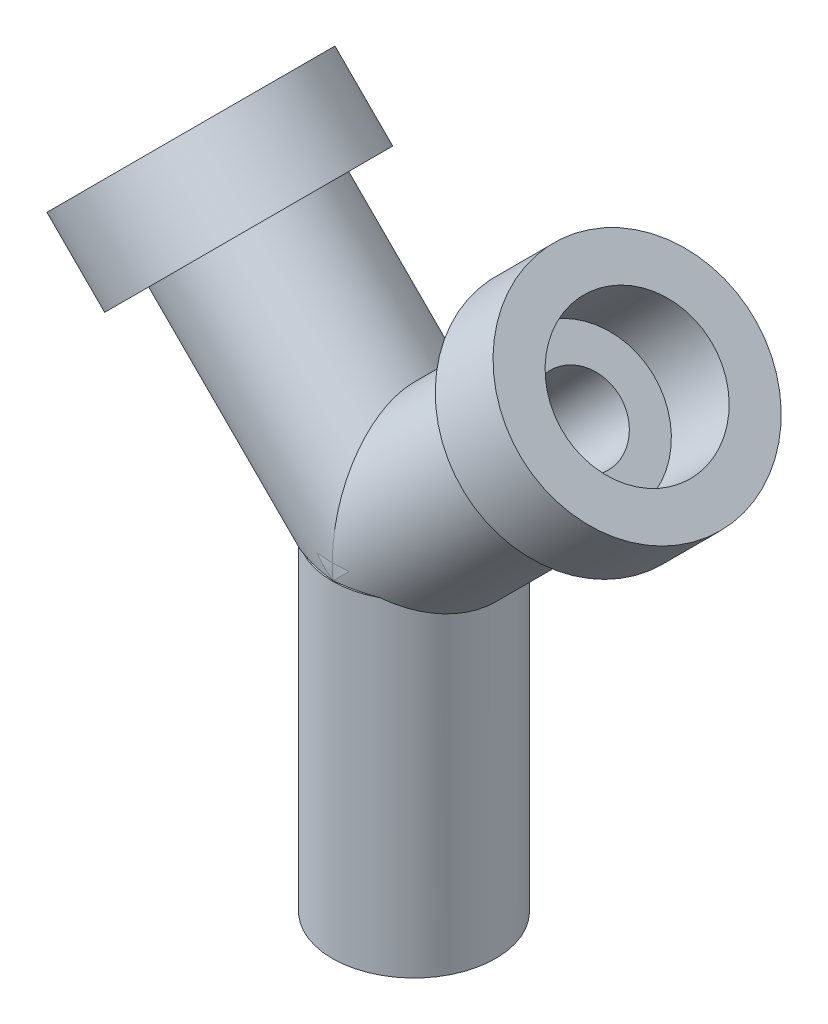
ISO-10303-21;
HEADER;
FILE_DESCRIPTION(('STEP AP214'),'2;1');
FILE_NAME('part.step','',(''),(''),'','','');
FILE_SCHEMA(('AUTOMOTIVE_DESIGN { 1 0 10303 214 1 1 1 1 }'));
ENDSEC;
DATA;
#1=APPLICATION_CONTEXT('core data for automotive mechanical design processes');
#2=APPLICATION_PROTOCOL_DEFINITION('international standard','automotive_design',2000,#1);
#3=PRODUCT_CONTEXT('',#1,'mechanical');
#4=PRODUCT('Part','Part','',(#3));
#5=PRODUCT_RELATED_PRODUCT_CATEGORY('part','',(#4));
#6=PRODUCT_DEFINITION_FORMATION('','',#4);
#7=PRODUCT_DEFINITION_CONTEXT('part definition',#1,'design');
#8=PRODUCT_DEFINITION('design','',#6,#7);
#9=PRODUCT_DEFINITION_SHAPE('','',#8);
#10=(LENGTH_UNIT() NAMED_UNIT(*) SI_UNIT(.MILLI.,.METRE.));
#11=(NAMED_UNIT(*) PLANE_ANGLE_UNIT() SI_UNIT($,.RADIAN.));
#12=(NAMED_UNIT(*) SI_UNIT($,.STERADIAN.) SOLID_ANGLE_UNIT());
#13=UNCERTAINTY_MEASURE_WITH_UNIT(LENGTH_MEASURE(1.E-05),#10,'distance_accuracy_value','');
#14=(GEOMETRIC_REPRESENTATION_CONTEXT(3) GLOBAL_UNCERTAINTY_ASSIGNED_CONTEXT((#13)) GLOBAL_UNIT_ASSIGNED_CONTEXT((#10,
#11,#12)) REPRESENTATION_CONTEXT('',''));
#15=CARTESIAN_POINT('',(0.,0.,0.));
#16=DIRECTION('',(0.,0.,1.));
#17=DIRECTION('',(1.,0.,0.));
#18=AXIS2_PLACEMENT_3D('',#15,#16,#17);
#19=CARTESIAN_POINT('',(-7.00017341424426,-7.67507080195636,0.));
#20=DIRECTION('',(-0.707106781186544,0.707106781186551,0.));
#21=DIRECTION('',(-0.707106781186551,-0.707106781186544,0.));
#22=AXIS2_PLACEMENT_3D('',#19,#20,#21);
#23=CYLINDRICAL_SURFACE('',#22,3.175);
#24=CARTESIAN_POINT('',(-20.4705575958479,5.79531337964745,0.));
#25=DIRECTION('',(-0.707106781186544,0.707106781186551,0.));
#26=DIRECTION('',(-0.707106781186551,-0.707106781186544,0.));
#27=AXIS2_PLACEMENT_3D('',#24,#25,#26);
#28=CIRCLE('',#27,3.175);
#29=CARTESIAN_POINT('',(-22.7156216261152,3.55024934938017,0.));
#30=VERTEX_POINT('',#29);
#31=EDGE_CURVE('E177',#30,#30,#28,.T.);
#32=ORIENTED_EDGE('',*,*,#31,.T.);
#33=EDGE_LOOP('',(#32));
#34=FACE_BOUND('',#33,.T.);
#35=CARTESIAN_POINT('',(-6.38034682848854,-8.29489738771209,0.));
#36=DIRECTION('',(0.,-1.,0.));
#37=DIRECTION('',(-1.,0.,0.));
#38=AXIS2_PLACEMENT_3D('',#35,#36,#37);
#39=ELLIPSE('',#38,4.49012806053455,3.175);
#40=CARTESIAN_POINT('',(-10.6127874993018,-8.29489738771209,1.06011696714215));
#41=VERTEX_POINT('',#40);
#42=CARTESIAN_POINT('',(-7.62,-8.29489738771209,3.05159876248185));
#43=VERTEX_POINT('',#42);
#44=EDGE_CURVE('E127',#41,#43,#39,.F.);
#45=ORIENTED_EDGE('',*,*,#44,.F.);
#46=CARTESIAN_POINT('',(-7.62,-7.05524421620062,0.));
#47=DIRECTION('',(-0.382683432365087,0.923879532511288,0.));
#48=DIRECTION('',(-0.923879532511288,-0.382683432365087,0.));
#49=AXIS2_PLACEMENT_3D('',#46,#47,#48);
#50=ELLIPSE('',#49,3.43659523592835,3.175);
#51=CARTESIAN_POINT('',(-10.6127874993018,-8.29489738771209,-1.06011696714215));
#52=VERTEX_POINT('',#51);
#53=EDGE_CURVE('E137',#41,#52,#50,.F.);
#54=ORIENTED_EDGE('',*,*,#53,.T.);
#55=CARTESIAN_POINT('',(-7.62,-8.29489738771209,-3.05159876248185));
#56=VERTEX_POINT('',#55);
#57=EDGE_CURVE('E130',#56,#52,#39,.F.);
#58=ORIENTED_EDGE('',*,*,#57,.F.);
#59=DIRECTION('',(-0.707106781186544,0.707106781186551,0.));
#60=VECTOR('',#59,1.);
#61=CARTESIAN_POINT('',(-7.61999999999999,-8.2948973877121,-3.05159876248185));
#62=LINE('',#61,#60);
#63=CARTESIAN_POINT('',(-8.85965317151146,-7.05524421620063,-3.05159876248186));
#64=VERTEX_POINT('',#63);
#65=EDGE_CURVE('E159',#64,#56,#62,.F.);
#66=ORIENTED_EDGE('',*,*,#65,.F.);
#67=CARTESIAN_POINT('',(-7.62,-7.05524421620062,0.));
#68=DIRECTION('',(0.,1.,0.));
#69=DIRECTION('',(-1.,0.,0.));
#70=AXIS2_PLACEMENT_3D('',#67,#68,#69);
#71=ELLIPSE('',#70,4.49012806053455,3.175);
#72=CARTESIAN_POINT('',(-7.62,-7.05524421620062,-3.175));
#73=VERTEX_POINT('',#72);
#74=EDGE_CURVE('E170',#73,#64,#71,.T.);
#75=ORIENTED_EDGE('',*,*,#74,.F.);
#76=CARTESIAN_POINT('',(-7.62,-7.05524421620062,0.));
#77=DIRECTION('',(-1.,0.,0.));
#78=DIRECTION('',(0.,1.,0.));
#79=AXIS2_PLACEMENT_3D('',#76,#77,#78);
#80=ELLIPSE('',#79,4.4901280605346,3.175);
#81=CARTESIAN_POINT('',(-7.62,-7.05524421620062,3.175));
#82=VERTEX_POINT('',#81);
#83=EDGE_CURVE('E164',#82,#73,#80,.T.);
#84=ORIENTED_EDGE('',*,*,#83,.F.);
#85=CARTESIAN_POINT('',(-8.85965317151146,-7.05524421620063,3.05159876248186));
#86=VERTEX_POINT('',#85);
#87=EDGE_CURVE('E167',#86,#82,#71,.T.);
#88=ORIENTED_EDGE('',*,*,#87,.F.);
#89=DIRECTION('',(-0.707106781186544,0.707106781186551,0.));
#90=VECTOR('',#89,1.);
#91=CARTESIAN_POINT('',(-7.61999999999999,-8.2948973877121,3.05159876248185));
#92=LINE('',#91,#90);
#93=EDGE_CURVE('E154',#43,#86,#92,.T.);
#94=ORIENTED_EDGE('',*,*,#93,.F.);
#95=EDGE_LOOP('',(#45,#54,#58,#66,#75,#84,#88,#94));
#96=FACE_BOUND('',#95,.T.);
#97=ADVANCED_FACE('F33',(#34,#96),#23,.F.);
#98=CARTESIAN_POINT('',(-8.23982658575574,-7.67507080195636,0.));
#99=DIRECTION('',(0.707106781186544,0.707106781186551,0.));
#100=DIRECTION('',(-0.707106781186551,0.707106781186544,0.));
#101=AXIS2_PLACEMENT_3D('',#98,#99,#100);
#102=CYLINDRICAL_SURFACE('',#101,3.175);
#103=CARTESIAN_POINT('',(5.23055759584792,5.79531337964745,0.));
#104=DIRECTION('',(-0.707106781186544,-0.707106781186551,0.));
#105=DIRECTION('',(0.707106781186551,-0.707106781186544,0.));
#106=AXIS2_PLACEMENT_3D('',#103,#104,#105);
#107=CIRCLE('',#106,3.175);
#108=CARTESIAN_POINT('',(7.47562162611522,3.55024934938017,0.));
#109=VERTEX_POINT('',#108);
#110=EDGE_CURVE('E150',#109,#109,#107,.T.);
#111=ORIENTED_EDGE('',*,*,#110,.F.);
#112=EDGE_LOOP('',(#111));
#113=FACE_BOUND('',#112,.T.);
#114=CARTESIAN_POINT('',(-7.62,-7.05524421620062,0.));
#115=DIRECTION('',(0.382683432365087,0.923879532511288,0.));
#116=DIRECTION('',(0.923879532511288,-0.382683432365087,0.));
#117=AXIS2_PLACEMENT_3D('',#114,#115,#116);
#118=ELLIPSE('',#117,3.43659523592835,3.175);
#119=CARTESIAN_POINT('',(-4.62721250069816,-8.29489738771209,1.06011696714215));
#120=VERTEX_POINT('',#119);
#121=CARTESIAN_POINT('',(-4.62721250069816,-8.29489738771209,-1.06011696714215));
#122=VERTEX_POINT('',#121);
#123=EDGE_CURVE('E11',#120,#122,#118,.T.);
#124=ORIENTED_EDGE('',*,*,#123,.F.);
#125=CARTESIAN_POINT('',(-8.85965317151146,-8.29489738771209,0.));
#126=DIRECTION('',(0.,-1.,0.));
#127=DIRECTION('',(1.,0.,0.));
#128=AXIS2_PLACEMENT_3D('',#125,#126,#127);
#129=ELLIPSE('',#128,4.49012806053455,3.175);
#130=EDGE_CURVE('E122',#120,#43,#129,.T.);
#131=ORIENTED_EDGE('',*,*,#130,.T.);
#132=DIRECTION('',(0.707106781186544,0.707106781186551,0.));
#133=VECTOR('',#132,1.);
#134=CARTESIAN_POINT('',(-7.62000000000001,-8.2948973877121,3.05159876248185));
#135=LINE('',#134,#133);
#136=CARTESIAN_POINT('',(-6.38034682848854,-7.05524421620063,3.05159876248186));
#137=VERTEX_POINT('',#136);
#138=EDGE_CURVE('E41',#137,#43,#135,.F.);
#139=ORIENTED_EDGE('',*,*,#138,.F.);
#140=CARTESIAN_POINT('',(-7.62,-7.05524421620062,0.));
#141=DIRECTION('',(0.,1.,0.));
#142=DIRECTION('',(-1.,0.,0.));
#143=AXIS2_PLACEMENT_3D('',#140,#141,#142);
#144=ELLIPSE('',#143,4.49012806053455,3.175);
#145=EDGE_CURVE('E55',#137,#82,#144,.F.);
#146=ORIENTED_EDGE('',*,*,#145,.T.);
#147=ORIENTED_EDGE('',*,*,#83,.T.);
#148=CARTESIAN_POINT('',(-6.38034682848854,-7.05524421620063,-3.05159876248186));
#149=VERTEX_POINT('',#148);
#150=EDGE_CURVE('E169',#73,#149,#144,.F.);
#151=ORIENTED_EDGE('',*,*,#150,.T.);
#152=DIRECTION('',(0.707106781186544,0.707106781186551,0.));
#153=VECTOR('',#152,1.);
#154=CARTESIAN_POINT('',(-7.62000000000001,-8.2948973877121,-3.05159876248185));
#155=LINE('',#154,#153);
#156=EDGE_CURVE('E142',#56,#149,#155,.T.);
#157=ORIENTED_EDGE('',*,*,#156,.F.);
#158=EDGE_CURVE('E132',#56,#122,#129,.T.);
#159=ORIENTED_EDGE('',*,*,#158,.T.);
#160=EDGE_LOOP('',(#124,#131,#139,#146,#147,#151,#157,#159));
#161=FACE_BOUND('',#160,.T.);
#162=ADVANCED_FACE('F139',(#113,#161),#102,.F.);
#163=CARTESIAN_POINT('',(-8.23982658575573,-7.67507080195636,0.));
#164=DIRECTION('',(-0.707106781186544,-0.707106781186552,0.));
#165=DIRECTION('',(0.707106781186552,-0.707106781186544,0.));
#166=AXIS2_PLACEMENT_3D('',#163,#164,#165);
#167=CYLINDRICAL_SURFACE('',#166,6.35);
#168=CARTESIAN_POINT('',(5.23055759584752,5.79531337964704,0.));
#169=DIRECTION('',(-0.707106781186544,-0.707106781186552,0.));
#170=DIRECTION('',(0.707106781186552,-0.707106781186544,0.));
#171=AXIS2_PLACEMENT_3D('',#168,#169,#170);
#172=CIRCLE('',#171,6.35000000000001);
#173=CARTESIAN_POINT('',(9.72068565638213,1.30518531911249,0.));
#174=VERTEX_POINT('',#173);
#175=EDGE_CURVE('E239',#174,#174,#172,.T.);
#176=ORIENTED_EDGE('',*,*,#175,.T.);
#177=EDGE_LOOP('',(#176));
#178=FACE_BOUND('',#177,.T.);
#179=CARTESIAN_POINT('',(-8.85965317151145,-8.29489738771208,0.));
#180=DIRECTION('',(0.,-1.,0.));
#181=DIRECTION('',(-1.,0.,0.));
#182=AXIS2_PLACEMENT_3D('',#179,#180,#181);
#183=ELLIPSE('',#182,8.98025612106911,6.35);
#184=CARTESIAN_POINT('',(-7.61999999999999,-8.29489738771208,-6.28920742281417));
#185=VERTEX_POINT('',#184);
#186=CARTESIAN_POINT('',(-4.62721250069818,-8.29489738771208,-5.60051095740583));
#187=VERTEX_POINT('',#186);
#188=EDGE_CURVE('E189',#185,#187,#183,.T.);
#189=ORIENTED_EDGE('',*,*,#188,.F.);
#190=DIRECTION('',(-0.707106781186544,-0.707106781186552,0.));
#191=VECTOR('',#190,1.);
#192=CARTESIAN_POINT('',(-7.62,-8.2948973877121,-6.28920742281417));
#193=LINE('',#192,#191);
#194=CARTESIAN_POINT('',(-6.38034682848851,-7.05524421620062,-6.28920742281416));
#195=VERTEX_POINT('',#194);
#196=EDGE_CURVE('E219',#195,#185,#193,.T.);
#197=ORIENTED_EDGE('',*,*,#196,.F.);
#198=CARTESIAN_POINT('',(-7.62,-7.05524421620062,0.));
#199=DIRECTION('',(0.,-1.,0.));
#200=DIRECTION('',(-1.,0.,0.));
#201=AXIS2_PLACEMENT_3D('',#198,#199,#200);
#202=ELLIPSE('',#201,8.98025612106911,6.35);
#203=CARTESIAN_POINT('',(-7.62,-7.05524421620062,-6.35));
#204=VERTEX_POINT('',#203);
#205=EDGE_CURVE('E232',#204,#195,#202,.T.);
#206=ORIENTED_EDGE('',*,*,#205,.F.);
#207=CARTESIAN_POINT('',(-7.62,-7.05524421620062,0.));
#208=DIRECTION('',(-1.,0.,0.));
#209=DIRECTION('',(0.,-1.,0.));
#210=AXIS2_PLACEMENT_3D('',#207,#208,#209);
#211=ELLIPSE('',#210,8.98025612106921,6.35);
#212=CARTESIAN_POINT('',(-7.62,-7.05524421620062,6.35));
#213=VERTEX_POINT('',#212);
#214=EDGE_CURVE('E224',#213,#204,#211,.T.);
#215=ORIENTED_EDGE('',*,*,#214,.F.);
#216=CARTESIAN_POINT('',(-6.38034682848856,-7.05524421620065,6.28920742281417));
#217=VERTEX_POINT('',#216);
#218=EDGE_CURVE('E228',#217,#213,#202,.T.);
#219=ORIENTED_EDGE('',*,*,#218,.F.);
#220=DIRECTION('',(-0.707106781186544,-0.707106781186552,0.));
#221=VECTOR('',#220,1.);
#222=CARTESIAN_POINT('',(-7.62,-8.2948973877121,6.28920742281417));
#223=LINE('',#222,#221);
#224=CARTESIAN_POINT('',(-7.62,-8.29489738771209,6.28920742281417));
#225=VERTEX_POINT('',#224);
#226=EDGE_CURVE('E216',#225,#217,#223,.F.);
#227=ORIENTED_EDGE('',*,*,#226,.F.);
#228=CARTESIAN_POINT('',(-4.62721250069879,-8.29489738771208,5.6005109574061));
#229=VERTEX_POINT('',#228);
#230=EDGE_CURVE('E193',#229,#225,#183,.T.);
#231=ORIENTED_EDGE('',*,*,#230,.F.);
#232=CARTESIAN_POINT('',(-7.62,-7.05524421620062,0.));
#233=DIRECTION('',(-0.382683432365087,-0.923879532511288,0.));
#234=DIRECTION('',(-0.923879532511288,0.382683432365087,0.));
#235=AXIS2_PLACEMENT_3D('',#232,#233,#234);
#236=ELLIPSE('',#235,6.8731904718567,6.35);
#237=EDGE_CURVE('E194',#187,#229,#236,.T.);
#238=ORIENTED_EDGE('',*,*,#237,.F.);
#239=EDGE_LOOP('',(#189,#197,#206,#215,#219,#227,#231,#238));
#240=FACE_BOUND('',#239,.T.);
#241=ADVANCED_FACE('F311',(#178,#240),#167,.T.);
#242=CARTESIAN_POINT('',(-7.00017341424427,-7.67507080195636,0.));
#243=DIRECTION('',(0.707106781186544,-0.707106781186552,0.));
#244=DIRECTION('',(-0.707106781186552,-0.707106781186544,0.));
#245=AXIS2_PLACEMENT_3D('',#242,#243,#244);
#246=CYLINDRICAL_SURFACE('',#245,6.35);
#247=CARTESIAN_POINT('',(-20.4705575958475,5.79531337964704,0.));
#248=DIRECTION('',(-0.707106781186544,0.707106781186552,0.));
#249=DIRECTION('',(-0.707106781186552,-0.707106781186544,0.));
#250=AXIS2_PLACEMENT_3D('',#247,#248,#249);
#251=CIRCLE('',#250,6.35000000000001);
#252=CARTESIAN_POINT('',(-24.9606856563821,1.30518531911249,0.));
#253=VERTEX_POINT('',#252);
#254=EDGE_CURVE('E201',#253,#253,#251,.T.);
#255=ORIENTED_EDGE('',*,*,#254,.F.);
#256=EDGE_LOOP('',(#255));
#257=FACE_BOUND('',#256,.T.);
#258=CARTESIAN_POINT('',(-6.38034682848855,-8.29489738771208,0.));
#259=DIRECTION('',(0.,-1.,0.));
#260=DIRECTION('',(1.,0.,0.));
#261=AXIS2_PLACEMENT_3D('',#258,#259,#260);
#262=ELLIPSE('',#261,8.98025612106911,6.35);
#263=CARTESIAN_POINT('',(-10.6127874993018,-8.29489738771208,5.60051095740583));
#264=VERTEX_POINT('',#263);
#265=EDGE_CURVE('E190',#225,#264,#262,.T.);
#266=ORIENTED_EDGE('',*,*,#265,.F.);
#267=DIRECTION('',(0.707106781186544,-0.707106781186552,0.));
#268=VECTOR('',#267,1.);
#269=CARTESIAN_POINT('',(-7.61999999999999,-8.2948973877121,6.28920742281417));
#270=LINE('',#269,#268);
#271=CARTESIAN_POINT('',(-8.85965317151144,-7.05524421620065,6.28920742281417));
#272=VERTEX_POINT('',#271);
#273=EDGE_CURVE('E258',#225,#272,#270,.F.);
#274=ORIENTED_EDGE('',*,*,#273,.T.);
#275=CARTESIAN_POINT('',(-7.62,-7.05524421620062,0.));
#276=DIRECTION('',(0.,-1.,0.));
#277=DIRECTION('',(-1.,0.,0.));
#278=AXIS2_PLACEMENT_3D('',#275,#276,#277);
#279=ELLIPSE('',#278,8.98025612106911,6.35);
#280=EDGE_CURVE('E235',#272,#213,#279,.F.);
#281=ORIENTED_EDGE('',*,*,#280,.T.);
#282=ORIENTED_EDGE('',*,*,#214,.T.);
#283=CARTESIAN_POINT('',(-8.85965317151144,-7.05524421620065,-6.28920742281417));
#284=VERTEX_POINT('',#283);
#285=EDGE_CURVE('E231',#204,#284,#279,.F.);
#286=ORIENTED_EDGE('',*,*,#285,.T.);
#287=DIRECTION('',(0.707106781186544,-0.707106781186552,0.));
#288=VECTOR('',#287,1.);
#289=CARTESIAN_POINT('',(-7.61999999999999,-8.2948973877121,-6.28920742281417));
#290=LINE('',#289,#288);
#291=EDGE_CURVE('E255',#284,#185,#290,.T.);
#292=ORIENTED_EDGE('',*,*,#291,.T.);
#293=CARTESIAN_POINT('',(-10.6127874993012,-8.29489738771208,-5.6005109574061));
#294=VERTEX_POINT('',#293);
#295=EDGE_CURVE('E186',#294,#185,#262,.T.);
#296=ORIENTED_EDGE('',*,*,#295,.F.);
#297=CARTESIAN_POINT('',(-7.62,-7.05524421620062,0.));
#298=DIRECTION('',(0.382683432365087,-0.923879532511288,0.));
#299=DIRECTION('',(0.923879532511288,0.382683432365087,0.));
#300=AXIS2_PLACEMENT_3D('',#297,#298,#299);
#301=ELLIPSE('',#300,6.8731904718567,6.35);
#302=EDGE_CURVE('E261',#264,#294,#301,.T.);
#303=ORIENTED_EDGE('',*,*,#302,.F.);
#304=EDGE_LOOP('',(#266,#274,#281,#282,#286,#292,#296,#303));
#305=FACE_BOUND('',#304,.T.);
#306=ADVANCED_FACE('F320',(#257,#305),#246,.T.);
#307=CARTESIAN_POINT('',(5.23055759584792,5.79531337964744,0.));
#308=DIRECTION('',(-0.707106781186544,-0.707106781186552,0.));
#309=DIRECTION('',(0.707106781186552,-0.707106781186544,0.));
#310=AXIS2_PLACEMENT_3D('',#307,#308,#309);
#311=PLANE('',#310);
#312=ORIENTED_EDGE('',*,*,#110,.T.);
#313=EDGE_LOOP('',(#312));
#314=FACE_BOUND('',#313,.T.);
#315=CARTESIAN_POINT('',(5.23055759584792,5.79531337964744,0.));
#316=DIRECTION('',(-0.707106781186544,-0.707106781186552,0.));
#317=DIRECTION('',(0.707106781186552,-0.707106781186544,0.));
#318=AXIS2_PLACEMENT_3D('',#315,#316,#317);
#319=CIRCLE('',#318,5.84200000000033);
#320=CARTESIAN_POINT('',(9.36147541153999,1.66439556395542,0.));
#321=VERTEX_POINT('',#320);
#322=EDGE_CURVE('E252',#321,#321,#319,.T.);
#323=ORIENTED_EDGE('',*,*,#322,.F.);
#324=EDGE_LOOP('',(#323));
#325=FACE_BOUND('',#324,.T.);
#326=ADVANCED_FACE('F35',(#314,#325),#311,.F.);
#327=CARTESIAN_POINT('',(-8.23982658575573,-7.67507080195636,0.));
#328=DIRECTION('',(-0.707106781186544,-0.707106781186552,0.));
#329=DIRECTION('',(0.707106781186552,-0.707106781186544,0.));
#330=AXIS2_PLACEMENT_3D('',#327,#328,#329);
#331=CYLINDRICAL_SURFACE('',#330,5.84200000000033);
#332=CARTESIAN_POINT('',(9.72068565638207,10.2854414401816,0.));
#333=DIRECTION('',(-0.707106781186544,-0.707106781186552,0.));
#334=DIRECTION('',(0.707106781186552,-0.707106781186544,0.));
#335=AXIS2_PLACEMENT_3D('',#332,#333,#334);
#336=CIRCLE('',#335,5.84200000000033);
#337=CARTESIAN_POINT('',(13.8516034720741,6.15452362448962,0.));
#338=VERTEX_POINT('',#337);
#339=EDGE_CURVE('E249',#338,#338,#336,.T.);
#340=ORIENTED_EDGE('',*,*,#339,.F.);
#341=EDGE_LOOP('',(#340));
#342=FACE_BOUND('',#341,.T.);
#343=ORIENTED_EDGE('',*,*,#322,.T.);
#344=EDGE_LOOP('',(#343));
#345=FACE_BOUND('',#344,.T.);
#346=ADVANCED_FACE('F441',(#342,#345),#331,.F.);
#347=CARTESIAN_POINT('',(5.58976784069,14.4163592558737,0.));
#348=DIRECTION('',(-0.707106781186544,-0.707106781186552,0.));
#349=DIRECTION('',(0.707106781186552,-0.707106781186544,0.));
#350=AXIS2_PLACEMENT_3D('',#347,#348,#349);
#351=PLANE('',#350);
#352=CARTESIAN_POINT('',(9.72068565638207,10.2854414401816,0.));
#353=DIRECTION('',(-0.707106781186544,-0.707106781186552,0.));
#354=DIRECTION('',(0.707106781186552,-0.707106781186544,0.));
#355=AXIS2_PLACEMENT_3D('',#352,#353,#354);
#356=CIRCLE('',#355,9.14400000000033);
#357=CARTESIAN_POINT('',(16.1864700635521,3.81965703301165,0.));
#358=VERTEX_POINT('',#357);
#359=EDGE_CURVE('E246',#358,#358,#356,.T.);
#360=ORIENTED_EDGE('',*,*,#359,.F.);
#361=EDGE_LOOP('',(#360));
#362=FACE_BOUND('',#361,.T.);
#363=ORIENTED_EDGE('',*,*,#339,.T.);
#364=EDGE_LOOP('',(#363));
#365=FACE_BOUND('',#364,.T.);
#366=ADVANCED_FACE('F602',(#362,#365),#351,.F.);
#367=CARTESIAN_POINT('',(-8.23982658575573,-7.67507080195636,0.));
#368=DIRECTION('',(-0.707106781186544,-0.707106781186552,0.));
#369=DIRECTION('',(0.707106781186552,-0.707106781186544,0.));
#370=AXIS2_PLACEMENT_3D('',#367,#368,#369);
#371=CYLINDRICAL_SURFACE('',#370,9.14400000000033);
#372=CARTESIAN_POINT('',(5.23055759584752,5.79531337964704,0.));
#373=DIRECTION('',(-0.707106781186544,-0.707106781186552,0.));
#374=DIRECTION('',(0.707106781186552,-0.707106781186544,0.));
#375=AXIS2_PLACEMENT_3D('',#372,#373,#374);
#376=CIRCLE('',#375,9.14400000000033);
#377=CARTESIAN_POINT('',(11.6963420030176,-0.670471027522946,0.));
#378=VERTEX_POINT('',#377);
#379=EDGE_CURVE('E243',#378,#378,#376,.T.);
#380=ORIENTED_EDGE('',*,*,#379,.F.);
#381=EDGE_LOOP('',(#380));
#382=FACE_BOUND('',#381,.T.);
#383=ORIENTED_EDGE('',*,*,#359,.T.);
#384=EDGE_LOOP('',(#383));
#385=FACE_BOUND('',#384,.T.);
#386=ADVANCED_FACE('F592',(#382,#385),#371,.T.);
#387=CARTESIAN_POINT('',(-1.23522681132254,12.261097786817,0.));
#388=DIRECTION('',(0.707106781186544,0.707106781186552,0.));
#389=DIRECTION('',(-0.707106781186552,0.707106781186544,0.));
#390=AXIS2_PLACEMENT_3D('',#387,#388,#389);
#391=PLANE('',#390);
#392=ORIENTED_EDGE('',*,*,#175,.F.);
#393=EDGE_LOOP('',(#392));
#394=FACE_BOUND('',#393,.T.);
#395=ORIENTED_EDGE('',*,*,#379,.T.);
#396=EDGE_LOOP('',(#395));
#397=FACE_BOUND('',#396,.T.);
#398=ADVANCED_FACE('F583',(#394,#397),#391,.F.);
#399=CARTESIAN_POINT('',(-14.0047731886775,12.261097786817,0.));
#400=DIRECTION('',(-0.707106781186544,0.707106781186552,0.));
#401=DIRECTION('',(0.707106781186552,0.707106781186544,0.));
#402=AXIS2_PLACEMENT_3D('',#399,#400,#401);
#403=PLANE('',#402);
#404=ORIENTED_EDGE('',*,*,#254,.T.);
#405=EDGE_LOOP('',(#404));
#406=FACE_BOUND('',#405,.T.);
#407=CARTESIAN_POINT('',(-20.4705575958475,5.79531337964704,0.));
#408=DIRECTION('',(-0.707106781186544,0.707106781186552,0.));
#409=DIRECTION('',(-0.707106781186552,-0.707106781186544,0.));
#410=AXIS2_PLACEMENT_3D('',#407,#408,#409);
#411=CIRCLE('',#410,9.14400000000033);
#412=CARTESIAN_POINT('',(-26.9363420030176,-0.670471027522946,0.));
#413=VERTEX_POINT('',#412);
#414=EDGE_CURVE('E204',#413,#413,#411,.T.);
#415=ORIENTED_EDGE('',*,*,#414,.F.);
#416=EDGE_LOOP('',(#415));
#417=FACE_BOUND('',#416,.T.);
#418=ADVANCED_FACE('F574',(#406,#417),#403,.F.);
#419=CARTESIAN_POINT('',(-7.00017341424427,-7.67507080195636,0.));
#420=DIRECTION('',(0.707106781186544,-0.707106781186552,0.));
#421=DIRECTION('',(-0.707106781186552,-0.707106781186544,0.));
#422=AXIS2_PLACEMENT_3D('',#419,#420,#421);
#423=CYLINDRICAL_SURFACE('',#422,9.14400000000033);
#424=ORIENTED_EDGE('',*,*,#414,.T.);
#425=EDGE_LOOP('',(#424));
#426=FACE_BOUND('',#425,.T.);
#427=CARTESIAN_POINT('',(-24.9606856563821,10.2854414401816,0.));
#428=DIRECTION('',(-0.707106781186544,0.707106781186552,0.));
#429=DIRECTION('',(-0.707106781186552,-0.707106781186544,0.));
#430=AXIS2_PLACEMENT_3D('',#427,#428,#429);
#431=CIRCLE('',#430,9.14400000000033);
#432=CARTESIAN_POINT('',(-31.4264700635521,3.81965703301165,0.));
#433=VERTEX_POINT('',#432);
#434=EDGE_CURVE('E207',#433,#433,#431,.T.);
#435=ORIENTED_EDGE('',*,*,#434,.F.);
#436=EDGE_LOOP('',(#435));
#437=FACE_BOUND('',#436,.T.);
#438=ADVANCED_FACE('F564',(#426,#437),#423,.T.);
#439=CARTESIAN_POINT('',(-20.82976784069,14.4163592558737,0.));
#440=DIRECTION('',(0.707106781186544,-0.707106781186552,0.));
#441=DIRECTION('',(-0.707106781186552,-0.707106781186544,0.));
#442=AXIS2_PLACEMENT_3D('',#439,#440,#441);
#443=PLANE('',#442);
#444=ORIENTED_EDGE('',*,*,#434,.T.);
#445=EDGE_LOOP('',(#444));
#446=FACE_BOUND('',#445,.T.);
#447=CARTESIAN_POINT('',(-24.9606856563821,10.2854414401816,0.));
#448=DIRECTION('',(-0.707106781186544,0.707106781186552,0.));
#449=DIRECTION('',(-0.707106781186552,-0.707106781186544,0.));
#450=AXIS2_PLACEMENT_3D('',#447,#448,#449);
#451=CIRCLE('',#450,5.84200000000033);
#452=CARTESIAN_POINT('',(-29.0916034720741,6.15452362448962,0.));
#453=VERTEX_POINT('',#452);
#454=EDGE_CURVE('E210',#453,#453,#451,.T.);
#455=ORIENTED_EDGE('',*,*,#454,.F.);
#456=EDGE_LOOP('',(#455));
#457=FACE_BOUND('',#456,.T.);
#458=ADVANCED_FACE('F554',(#446,#457),#443,.F.);
#459=CARTESIAN_POINT('',(-7.00017341424427,-7.67507080195636,0.));
#460=DIRECTION('',(0.707106781186544,-0.707106781186552,0.));
#461=DIRECTION('',(-0.707106781186552,-0.707106781186544,0.));
#462=AXIS2_PLACEMENT_3D('',#459,#460,#461);
#463=CYLINDRICAL_SURFACE('',#462,5.84200000000033);
#464=ORIENTED_EDGE('',*,*,#454,.T.);
#465=EDGE_LOOP('',(#464));
#466=FACE_BOUND('',#465,.T.);
#467=CARTESIAN_POINT('',(-20.4705575958479,5.79531337964744,0.));
#468=DIRECTION('',(-0.707106781186544,0.707106781186552,0.));
#469=DIRECTION('',(-0.707106781186552,-0.707106781186544,0.));
#470=AXIS2_PLACEMENT_3D('',#467,#468,#469);
#471=CIRCLE('',#470,5.84200000000033);
#472=CARTESIAN_POINT('',(-24.60147541154,1.66439556395542,0.));
#473=VERTEX_POINT('',#472);
#474=EDGE_CURVE('E213',#473,#473,#471,.T.);
#475=ORIENTED_EDGE('',*,*,#474,.F.);
#476=EDGE_LOOP('',(#475));
#477=FACE_BOUND('',#476,.T.);
#478=ADVANCED_FACE('F453',(#466,#477),#463,.F.);
#479=CARTESIAN_POINT('',(-20.4705575958479,5.79531337964744,0.));
#480=DIRECTION('',(0.707106781186544,-0.707106781186552,0.));
#481=DIRECTION('',(-0.707106781186552,-0.707106781186544,0.));
#482=AXIS2_PLACEMENT_3D('',#479,#480,#481);
#483=PLANE('',#482);
#484=ORIENTED_EDGE('',*,*,#31,.F.);
#485=EDGE_LOOP('',(#484));
#486=FACE_BOUND('',#485,.T.);
#487=ORIENTED_EDGE('',*,*,#474,.T.);
#488=EDGE_LOOP('',(#487));
#489=FACE_BOUND('',#488,.T.);
#490=ADVANCED_FACE('F342',(#486,#489),#483,.F.);
#491=CARTESIAN_POINT('',(-12.7299546462903,-3.18494274142181,0.));
#492=DIRECTION('',(0.707106781186544,0.707106781186552,0.));
#493=DIRECTION('',(-0.707106781186552,0.707106781186544,0.));
#494=AXIS2_PLACEMENT_3D('',#491,#492,#493);
#495=PLANE('',#494);
#496=ORIENTED_EDGE('',*,*,#291,.F.);
#497=CARTESIAN_POINT('',(-8.23982658575573,-7.67507080195636,0.));
#498=DIRECTION('',(-0.707106781186544,-0.707106781186552,0.));
#499=DIRECTION('',(0.707106781186552,-0.707106781186544,0.));
#500=AXIS2_PLACEMENT_3D('',#497,#498,#499);
#501=CIRCLE('',#500,6.35);
#502=EDGE_CURVE('E240',#284,#185,#501,.T.);
#503=ORIENTED_EDGE('',*,*,#502,.T.);
#504=EDGE_LOOP('',(#496,#503));
#505=FACE_BOUND('',#504,.T.);
#506=ADVANCED_FACE('F332',(#505),#495,.F.);
#507=ORIENTED_EDGE('',*,*,#285,.F.);
#508=CARTESIAN_POINT('',(-7.62,-7.05524421620062,0.));
#509=DIRECTION('',(-1.,0.,0.));
#510=DIRECTION('',(0.,-1.,0.));
#511=AXIS2_PLACEMENT_3D('',#508,#509,#510);
#512=ELLIPSE('',#511,8.98025612106921,6.35);
#513=EDGE_CURVE('E221',#185,#204,#512,.F.);
#514=ORIENTED_EDGE('',*,*,#513,.F.);
#515=ORIENTED_EDGE('',*,*,#502,.F.);
#516=EDGE_LOOP('',(#507,#514,#515));
#517=FACE_BOUND('',#516,.T.);
#518=ADVANCED_FACE('F330',(#517),#167,.T.);
#519=ORIENTED_EDGE('',*,*,#273,.F.);
#520=EDGE_CURVE('E236',#225,#272,#501,.T.);
#521=ORIENTED_EDGE('',*,*,#520,.T.);
#522=EDGE_LOOP('',(#519,#521));
#523=FACE_BOUND('',#522,.T.);
#524=ADVANCED_FACE('F328',(#523),#495,.F.);
#525=ORIENTED_EDGE('',*,*,#280,.F.);
#526=ORIENTED_EDGE('',*,*,#520,.F.);
#527=EDGE_CURVE('E225',#213,#225,#512,.F.);
#528=ORIENTED_EDGE('',*,*,#527,.F.);
#529=EDGE_LOOP('',(#525,#526,#528));
#530=FACE_BOUND('',#529,.T.);
#531=ADVANCED_FACE('F324',(#530),#167,.T.);
#532=CARTESIAN_POINT('',(-2.51004535370966,-3.18494274142181,0.));
#533=DIRECTION('',(-0.707106781186544,0.707106781186552,0.));
#534=DIRECTION('',(0.707106781186552,0.707106781186544,0.));
#535=AXIS2_PLACEMENT_3D('',#532,#533,#534);
#536=PLANE('',#535);
#537=CARTESIAN_POINT('',(-7.00017341424426,-7.67507080195636,0.));
#538=DIRECTION('',(-0.707106781186544,0.707106781186552,0.));
#539=DIRECTION('',(-0.707106781186552,-0.707106781186544,0.));
#540=AXIS2_PLACEMENT_3D('',#537,#538,#539);
#541=CIRCLE('',#540,6.35);
#542=EDGE_CURVE('E198',#225,#217,#541,.T.);
#543=ORIENTED_EDGE('',*,*,#542,.F.);
#544=ORIENTED_EDGE('',*,*,#226,.T.);
#545=EDGE_LOOP('',(#543,#544));
#546=FACE_BOUND('',#545,.T.);
#547=ADVANCED_FACE('F337',(#546),#536,.F.);
#548=ORIENTED_EDGE('',*,*,#218,.T.);
#549=ORIENTED_EDGE('',*,*,#527,.T.);
#550=ORIENTED_EDGE('',*,*,#542,.T.);
#551=EDGE_LOOP('',(#548,#549,#550));
#552=FACE_BOUND('',#551,.T.);
#553=ADVANCED_FACE('F481',(#552),#246,.T.);
#554=ORIENTED_EDGE('',*,*,#513,.T.);
#555=ORIENTED_EDGE('',*,*,#205,.T.);
#556=EDGE_CURVE('E197',#195,#185,#541,.T.);
#557=ORIENTED_EDGE('',*,*,#556,.T.);
#558=EDGE_LOOP('',(#554,#555,#557));
#559=FACE_BOUND('',#558,.T.);
#560=ADVANCED_FACE('F486',(#559),#246,.T.);
#561=ORIENTED_EDGE('',*,*,#556,.F.);
#562=ORIENTED_EDGE('',*,*,#196,.T.);
#563=EDGE_LOOP('',(#561,#562));
#564=FACE_BOUND('',#563,.T.);
#565=ADVANCED_FACE('F303',(#564),#536,.F.);
#566=CARTESIAN_POINT('',(-7.62,-8.29489738771208,0.));
#567=DIRECTION('',(0.,1.,0.));
#568=DIRECTION('',(0.,0.,1.));
#569=AXIS2_PLACEMENT_3D('',#566,#567,#568);
#570=CYLINDRICAL_SURFACE('',#569,6.35);
#571=CARTESIAN_POINT('',(-7.62,-33.6948973877121,0.));
#572=DIRECTION('',(0.,1.,0.));
#573=DIRECTION('',(0.,0.,1.));
#574=AXIS2_PLACEMENT_3D('',#571,#572,#573);
#575=CIRCLE('',#574,6.35);
#576=CARTESIAN_POINT('',(-7.62,-33.6948973877121,6.35));
#577=VERTEX_POINT('',#576);
#578=EDGE_CURVE('E183',#577,#577,#575,.T.);
#579=ORIENTED_EDGE('',*,*,#578,.T.);
#580=EDGE_LOOP('',(#579));
#581=FACE_BOUND('',#580,.T.);
#582=CARTESIAN_POINT('',(-7.62,-8.29489738771208,0.));
#583=DIRECTION('',(0.,1.,0.));
#584=DIRECTION('',(0.,0.,1.));
#585=AXIS2_PLACEMENT_3D('',#582,#583,#584);
#586=CIRCLE('',#585,6.35);
#587=EDGE_CURVE('E182',#187,#294,#586,.T.);
#588=ORIENTED_EDGE('',*,*,#587,.F.);
#589=ORIENTED_EDGE('',*,*,#237,.T.);
#590=EDGE_CURVE('E175',#264,#229,#586,.T.);
#591=ORIENTED_EDGE('',*,*,#590,.F.);
#592=ORIENTED_EDGE('',*,*,#302,.T.);
#593=EDGE_LOOP('',(#588,#589,#591,#592));
#594=FACE_BOUND('',#593,.T.);
#595=ADVANCED_FACE('F299',(#581,#594),#570,.T.);
#596=CARTESIAN_POINT('',(-7.62,-8.29489738771208,0.));
#597=DIRECTION('',(0.,-1.,0.));
#598=DIRECTION('',(0.,0.,-1.));
#599=AXIS2_PLACEMENT_3D('',#596,#597,#598);
#600=PLANE('',#599);
#601=ORIENTED_EDGE('',*,*,#590,.T.);
#602=ORIENTED_EDGE('',*,*,#230,.T.);
#603=ORIENTED_EDGE('',*,*,#265,.T.);
#604=EDGE_LOOP('',(#601,#602,#603));
#605=FACE_BOUND('',#604,.T.);
#606=ADVANCED_FACE('F302',(#605),#600,.F.);
#607=ORIENTED_EDGE('',*,*,#295,.T.);
#608=ORIENTED_EDGE('',*,*,#188,.T.);
#609=ORIENTED_EDGE('',*,*,#587,.T.);
#610=EDGE_LOOP('',(#607,#608,#609));
#611=FACE_BOUND('',#610,.T.);
#612=ADVANCED_FACE('F295',(#611),#600,.F.);
#613=CARTESIAN_POINT('',(-7.62,-33.6948973877121,0.));
#614=DIRECTION('',(0.,1.,0.));
#615=DIRECTION('',(0.,0.,1.));
#616=AXIS2_PLACEMENT_3D('',#613,#614,#615);
#617=PLANE('',#616);
#618=CARTESIAN_POINT('',(-7.62,-33.6948973877121,0.));
#619=DIRECTION('',(0.,-1.,0.));
#620=DIRECTION('',(0.,0.,-1.));
#621=AXIS2_PLACEMENT_3D('',#618,#619,#620);
#622=CIRCLE('',#621,3.175);
#623=CARTESIAN_POINT('',(-7.62,-33.6948973877121,-3.175));
#624=VERTEX_POINT('',#623);
#625=EDGE_CURVE('E147',#624,#624,#622,.T.);
#626=ORIENTED_EDGE('',*,*,#625,.F.);
#627=EDGE_LOOP('',(#626));
#628=FACE_BOUND('',#627,.T.);
#629=ORIENTED_EDGE('',*,*,#578,.F.);
#630=EDGE_LOOP('',(#629));
#631=FACE_BOUND('',#630,.T.);
#632=ADVANCED_FACE('F291',(#628,#631),#617,.F.);
#633=CARTESIAN_POINT('',(-7.00017341424426,-7.67507080195636,0.));
#634=DIRECTION('',(-0.707106781186544,0.707106781186551,0.));
#635=DIRECTION('',(-0.707106781186551,-0.707106781186544,0.));
#636=AXIS2_PLACEMENT_3D('',#633,#634,#635);
#637=PLANE('',#636);
#638=CARTESIAN_POINT('',(-7.00017341424426,-7.67507080195636,0.));
#639=DIRECTION('',(-0.707106781186544,0.707106781186551,0.));
#640=DIRECTION('',(-0.707106781186551,-0.707106781186544,0.));
#641=AXIS2_PLACEMENT_3D('',#638,#639,#640);
#642=CIRCLE('',#641,3.175);
#643=EDGE_CURVE('E176',#149,#56,#642,.T.);
#644=ORIENTED_EDGE('',*,*,#643,.T.);
#645=ORIENTED_EDGE('',*,*,#156,.T.);
#646=EDGE_LOOP('',(#644,#645));
#647=FACE_BOUND('',#646,.T.);
#648=ADVANCED_FACE('F294',(#647),#637,.T.);
#649=ORIENTED_EDGE('',*,*,#150,.F.);
#650=CARTESIAN_POINT('',(-7.62,-7.05524421620062,0.));
#651=DIRECTION('',(-1.,0.,0.));
#652=DIRECTION('',(0.,1.,0.));
#653=AXIS2_PLACEMENT_3D('',#650,#651,#652);
#654=ELLIPSE('',#653,4.4901280605346,3.175);
#655=EDGE_CURVE('E162',#56,#73,#654,.F.);
#656=ORIENTED_EDGE('',*,*,#655,.F.);
#657=ORIENTED_EDGE('',*,*,#643,.F.);
#658=EDGE_LOOP('',(#649,#656,#657));
#659=FACE_BOUND('',#658,.T.);
#660=ADVANCED_FACE('F347',(#659),#23,.F.);
#661=EDGE_CURVE('E172',#43,#137,#642,.T.);
#662=ORIENTED_EDGE('',*,*,#661,.T.);
#663=ORIENTED_EDGE('',*,*,#138,.T.);
#664=EDGE_LOOP('',(#662,#663));
#665=FACE_BOUND('',#664,.T.);
#666=ADVANCED_FACE('F266',(#665),#637,.T.);
#667=ORIENTED_EDGE('',*,*,#145,.F.);
#668=ORIENTED_EDGE('',*,*,#661,.F.);
#669=EDGE_CURVE('E165',#82,#43,#654,.F.);
#670=ORIENTED_EDGE('',*,*,#669,.F.);
#671=EDGE_LOOP('',(#667,#668,#670));
#672=FACE_BOUND('',#671,.T.);
#673=ADVANCED_FACE('F270',(#672),#23,.F.);
#674=CARTESIAN_POINT('',(-8.23982658575574,-7.67507080195636,0.));
#675=DIRECTION('',(0.707106781186544,0.707106781186551,0.));
#676=DIRECTION('',(0.707106781186551,-0.707106781186544,0.));
#677=AXIS2_PLACEMENT_3D('',#674,#675,#676);
#678=PLANE('',#677);
#679=ORIENTED_EDGE('',*,*,#93,.T.);
#680=CARTESIAN_POINT('',(-8.23982658575574,-7.67507080195636,0.));
#681=DIRECTION('',(-0.707106781186544,-0.707106781186551,0.));
#682=DIRECTION('',(0.707106781186551,-0.707106781186544,0.));
#683=AXIS2_PLACEMENT_3D('',#680,#681,#682);
#684=CIRCLE('',#683,3.175);
#685=EDGE_CURVE('E151',#43,#86,#684,.T.);
#686=ORIENTED_EDGE('',*,*,#685,.F.);
#687=EDGE_LOOP('',(#679,#686));
#688=FACE_BOUND('',#687,.T.);
#689=ADVANCED_FACE('F357',(#688),#678,.T.);
#690=ORIENTED_EDGE('',*,*,#669,.T.);
#691=ORIENTED_EDGE('',*,*,#685,.T.);
#692=ORIENTED_EDGE('',*,*,#87,.T.);
#693=EDGE_LOOP('',(#690,#691,#692));
#694=FACE_BOUND('',#693,.T.);
#695=ADVANCED_FACE('F353',(#694),#102,.F.);
#696=ORIENTED_EDGE('',*,*,#74,.T.);
#697=EDGE_CURVE('E155',#64,#56,#684,.T.);
#698=ORIENTED_EDGE('',*,*,#697,.T.);
#699=ORIENTED_EDGE('',*,*,#655,.T.);
#700=EDGE_LOOP('',(#696,#698,#699));
#701=FACE_BOUND('',#700,.T.);
#702=ADVANCED_FACE('F278',(#701),#102,.F.);
#703=ORIENTED_EDGE('',*,*,#65,.T.);
#704=ORIENTED_EDGE('',*,*,#697,.F.);
#705=EDGE_LOOP('',(#703,#704));
#706=FACE_BOUND('',#705,.T.);
#707=ADVANCED_FACE('F285',(#706),#678,.T.);
#708=CARTESIAN_POINT('',(-7.62,-8.29489738771209,0.));
#709=DIRECTION('',(0.,-1.,0.));
#710=DIRECTION('',(0.,0.,-1.));
#711=AXIS2_PLACEMENT_3D('',#708,#709,#710);
#712=CYLINDRICAL_SURFACE('',#711,3.175);
#713=ORIENTED_EDGE('',*,*,#625,.T.);
#714=EDGE_LOOP('',(#713));
#715=FACE_BOUND('',#714,.T.);
#716=CARTESIAN_POINT('',(-7.62,-8.29489738771209,0.));
#717=DIRECTION('',(0.,-1.,0.));
#718=DIRECTION('',(0.,0.,-1.));
#719=AXIS2_PLACEMENT_3D('',#716,#717,#718);
#720=CIRCLE('',#719,3.175);
#721=EDGE_CURVE('E125',#120,#41,#720,.T.);
#722=ORIENTED_EDGE('',*,*,#721,.F.);
#723=ORIENTED_EDGE('',*,*,#123,.T.);
#724=EDGE_CURVE('E48',#52,#122,#720,.T.);
#725=ORIENTED_EDGE('',*,*,#724,.F.);
#726=ORIENTED_EDGE('',*,*,#53,.F.);
#727=EDGE_LOOP('',(#722,#723,#725,#726));
#728=FACE_BOUND('',#727,.T.);
#729=ADVANCED_FACE('F134',(#715,#728),#712,.F.);
#730=CARTESIAN_POINT('',(-7.62,-8.29489738771209,0.));
#731=DIRECTION('',(0.,-1.,0.));
#732=DIRECTION('',(0.,0.,-1.));
#733=AXIS2_PLACEMENT_3D('',#730,#731,#732);
#734=PLANE('',#733);
#735=ORIENTED_EDGE('',*,*,#44,.T.);
#736=ORIENTED_EDGE('',*,*,#130,.F.);
#737=ORIENTED_EDGE('',*,*,#721,.T.);
#738=EDGE_LOOP('',(#735,#736,#737));
#739=FACE_BOUND('',#738,.T.);
#740=ADVANCED_FACE('F124',(#739),#734,.T.);
#741=ORIENTED_EDGE('',*,*,#57,.T.);
#742=ORIENTED_EDGE('',*,*,#724,.T.);
#743=ORIENTED_EDGE('',*,*,#158,.F.);
#744=EDGE_LOOP('',(#741,#742,#743));
#745=FACE_BOUND('',#744,.T.);
#746=ADVANCED_FACE('F286',(#745),#734,.T.);
#747=CLOSED_SHELL('',(#97,#162,#241,#306,#326,#346,#366,#386,#398,#418,#438,#458,#478,#490,#506,
#518,#524,#531,#547,#553,#560,#565,#595,#606,#612,#632,#648,#660,#666,#673,#689,#695,#702,#707,
#729,#740,#746));
#748=MANIFOLD_SOLID_BREP('B2',#747);
#749=ADVANCED_BREP_SHAPE_REPRESENTATION('',(#18,#748),#14);
#750=SHAPE_DEFINITION_REPRESENTATION(#9,#749);
ENDSEC;
END-ISO-10303-21;
